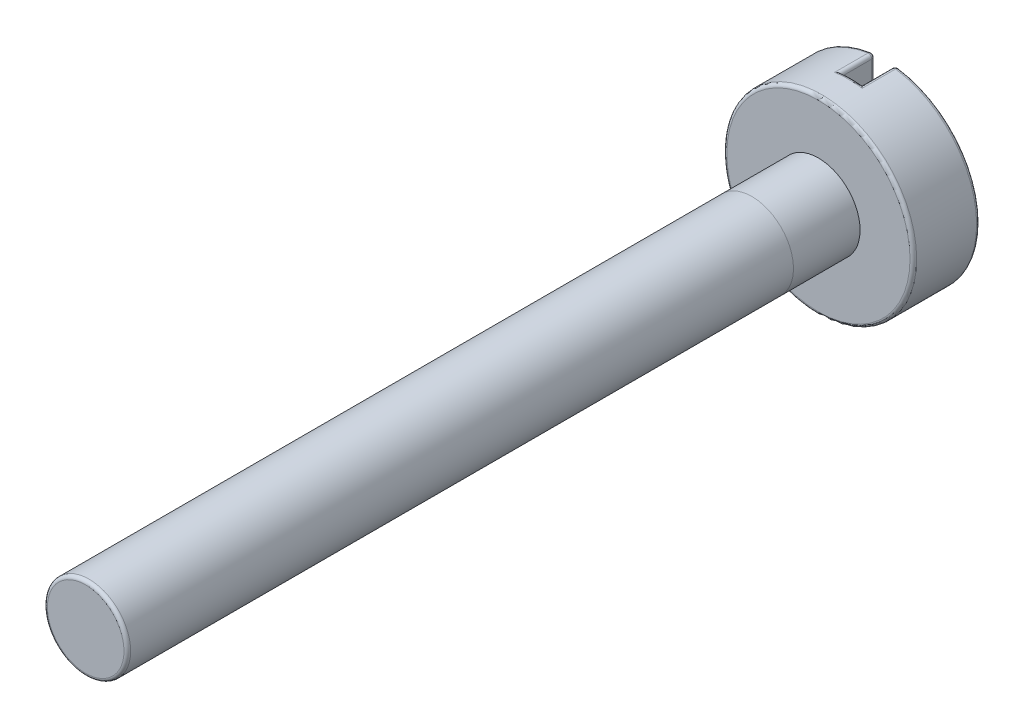
ISO-10303-21;
HEADER;
FILE_DESCRIPTION(('STEP AP214'),'2;1');
FILE_NAME('part.step','',(''),(''),'','','');
FILE_SCHEMA(('AUTOMOTIVE_DESIGN { 1 0 10303 214 1 1 1 1 }'));
ENDSEC;
DATA;
#1=APPLICATION_CONTEXT('core data for automotive mechanical design processes');
#2=APPLICATION_PROTOCOL_DEFINITION('international standard','automotive_design',2000,#1);
#3=PRODUCT_CONTEXT('',#1,'mechanical');
#4=PRODUCT('Part','Part','',(#3));
#5=PRODUCT_RELATED_PRODUCT_CATEGORY('part','',(#4));
#6=PRODUCT_DEFINITION_FORMATION('','',#4);
#7=PRODUCT_DEFINITION_CONTEXT('part definition',#1,'design');
#8=PRODUCT_DEFINITION('design','',#6,#7);
#9=PRODUCT_DEFINITION_SHAPE('','',#8);
#10=(LENGTH_UNIT() NAMED_UNIT(*) SI_UNIT(.MILLI.,.METRE.));
#11=(NAMED_UNIT(*) PLANE_ANGLE_UNIT() SI_UNIT($,.RADIAN.));
#12=(NAMED_UNIT(*) SI_UNIT($,.STERADIAN.) SOLID_ANGLE_UNIT());
#13=UNCERTAINTY_MEASURE_WITH_UNIT(LENGTH_MEASURE(1.E-05),#10,'distance_accuracy_value','');
#14=(GEOMETRIC_REPRESENTATION_CONTEXT(3) GLOBAL_UNCERTAINTY_ASSIGNED_CONTEXT((#13)) GLOBAL_UNIT_ASSIGNED_CONTEXT((#10,
#11,#12)) REPRESENTATION_CONTEXT('',''));
#15=CARTESIAN_POINT('',(0.,0.,0.));
#16=DIRECTION('',(0.,0.,1.));
#17=DIRECTION('',(1.,0.,0.));
#18=AXIS2_PLACEMENT_3D('',#15,#16,#17);
#19=CARTESIAN_POINT('',(0.,0.,11.));
#20=DIRECTION('',(0.,0.,-1.));
#21=DIRECTION('',(-1.,0.,0.));
#22=AXIS2_PLACEMENT_3D('',#19,#20,#21);
#23=CYLINDRICAL_SURFACE('',#22,0.625);
#24=CARTESIAN_POINT('',(0.,0.,10.95));
#25=DIRECTION('',(0.,0.,1.));
#26=DIRECTION('',(1.,0.,0.));
#27=AXIS2_PLACEMENT_3D('',#24,#25,#26);
#28=CIRCLE('',#27,0.625);
#29=CARTESIAN_POINT('',(0.625,0.,10.95));
#30=VERTEX_POINT('',#29);
#31=EDGE_CURVE('E175',#30,#30,#28,.F.);
#32=ORIENTED_EDGE('',*,*,#31,.T.);
#33=EDGE_LOOP('',(#32));
#34=FACE_BOUND('',#33,.T.);
#35=CARTESIAN_POINT('',(0.,0.,0.999999999999999));
#36=DIRECTION('',(0.,0.,-1.));
#37=DIRECTION('',(-1.,0.,0.));
#38=AXIS2_PLACEMENT_3D('',#35,#36,#37);
#39=CIRCLE('',#38,0.625);
#40=CARTESIAN_POINT('',(-0.625,0.,0.999999999999999));
#41=VERTEX_POINT('',#40);
#42=EDGE_CURVE('E11',#41,#41,#39,.T.);
#43=ORIENTED_EDGE('',*,*,#42,.F.);
#44=EDGE_LOOP('',(#43));
#45=FACE_BOUND('',#44,.T.);
#46=ADVANCED_FACE('F45',(#34,#45),#23,.T.);
#47=CARTESIAN_POINT('',(0.,0.,-1.));
#48=DIRECTION('',(0.,0.,1.));
#49=DIRECTION('',(1.,0.,0.));
#50=AXIS2_PLACEMENT_3D('',#47,#48,#49);
#51=PLANE('',#50);
#52=DIRECTION('',(0.,-1.,0.));
#53=VECTOR('',#52,1.);
#54=CARTESIAN_POINT('',(-0.2,0.,-1.));
#55=LINE('',#54,#53);
#56=CARTESIAN_POINT('',(-0.2,1.36037678604128,-1.));
#57=VERTEX_POINT('',#56);
#58=CARTESIAN_POINT('',(-0.2,-1.36037678604128,-1.));
#59=VERTEX_POINT('',#58);
#60=EDGE_CURVE('E212',#57,#59,#55,.T.);
#61=ORIENTED_EDGE('',*,*,#60,.T.);
#62=CARTESIAN_POINT('',(0.,0.,-1.));
#63=DIRECTION('',(0.,0.,1.));
#64=DIRECTION('',(1.,0.,0.));
#65=AXIS2_PLACEMENT_3D('',#62,#63,#64);
#66=CIRCLE('',#65,1.375);
#67=EDGE_CURVE('E214',#59,#57,#66,.F.);
#68=ORIENTED_EDGE('',*,*,#67,.T.);
#69=EDGE_LOOP('',(#61,#68));
#70=FACE_BOUND('',#69,.T.);
#71=ADVANCED_FACE('F311',(#70),#51,.F.);
#72=ORIENTED_EDGE('',*,*,#42,.T.);
#73=EDGE_LOOP('',(#72));
#74=FACE_BOUND('',#73,.T.);
#75=CARTESIAN_POINT('',(0.,0.,0.));
#76=DIRECTION('',(0.,0.,1.));
#77=DIRECTION('',(1.,0.,0.));
#78=AXIS2_PLACEMENT_3D('',#75,#76,#77);
#79=CIRCLE('',#78,0.625);
#80=CARTESIAN_POINT('',(0.625,0.,0.));
#81=VERTEX_POINT('',#80);
#82=EDGE_CURVE('E337',#81,#81,#79,.T.);
#83=ORIENTED_EDGE('',*,*,#82,.T.);
#84=EDGE_LOOP('',(#83));
#85=FACE_BOUND('',#84,.T.);
#86=ADVANCED_FACE('F314',(#74,#85),#23,.T.);
#87=CARTESIAN_POINT('',(0.,0.,11.));
#88=DIRECTION('',(0.,0.,1.));
#89=DIRECTION('',(1.,0.,0.));
#90=AXIS2_PLACEMENT_3D('',#87,#88,#89);
#91=PLANE('',#90);
#92=CARTESIAN_POINT('',(0.,0.,11.));
#93=DIRECTION('',(0.,0.,1.));
#94=DIRECTION('',(1.,0.,0.));
#95=AXIS2_PLACEMENT_3D('',#92,#93,#94);
#96=CIRCLE('',#95,0.575);
#97=CARTESIAN_POINT('',(0.575,0.,11.));
#98=VERTEX_POINT('',#97);
#99=EDGE_CURVE('E339',#98,#98,#96,.T.);
#100=ORIENTED_EDGE('',*,*,#99,.T.);
#101=EDGE_LOOP('',(#100));
#102=FACE_BOUND('',#101,.T.);
#103=ADVANCED_FACE('F326',(#102),#91,.T.);
#104=CARTESIAN_POINT('',(0.,0.,-1.));
#105=DIRECTION('',(0.,0.,1.));
#106=DIRECTION('',(1.,0.,0.));
#107=AXIS2_PLACEMENT_3D('',#104,#105,#106);
#108=CYLINDRICAL_SURFACE('',#107,1.425);
#109=CARTESIAN_POINT('',(0.,0.,-0.05));
#110=DIRECTION('',(0.,0.,1.));
#111=DIRECTION('',(1.,0.,0.));
#112=AXIS2_PLACEMENT_3D('',#109,#110,#111);
#113=CIRCLE('',#112,1.425);
#114=CARTESIAN_POINT('',(1.425,0.,-0.05));
#115=VERTEX_POINT('',#114);
#116=EDGE_CURVE('E189',#115,#115,#113,.F.);
#117=ORIENTED_EDGE('',*,*,#116,.T.);
#118=EDGE_LOOP('',(#117));
#119=FACE_BOUND('',#118,.T.);
#120=DIRECTION('',(0.,0.,1.));
#121=VECTOR('',#120,1.);
#122=CARTESIAN_POINT('',(0.207272727272727,-1.40984503280642,-1.));
#123=LINE('',#122,#121);
#124=CARTESIAN_POINT('',(0.207272727272727,-1.40984503280642,-0.45));
#125=VERTEX_POINT('',#124);
#126=CARTESIAN_POINT('',(0.207272727272727,-1.40984503280642,-0.95));
#127=VERTEX_POINT('',#126);
#128=EDGE_CURVE('E185',#125,#127,#123,.F.);
#129=ORIENTED_EDGE('',*,*,#128,.T.);
#130=CARTESIAN_POINT('',(0.,0.,-0.95));
#131=DIRECTION('',(0.,0.,1.));
#132=DIRECTION('',(1.,0.,0.));
#133=AXIS2_PLACEMENT_3D('',#130,#131,#132);
#134=CIRCLE('',#133,1.425);
#135=CARTESIAN_POINT('',(0.207272727272727,1.40984503280642,-0.95));
#136=VERTEX_POINT('',#135);
#137=EDGE_CURVE('E187',#127,#136,#134,.T.);
#138=ORIENTED_EDGE('',*,*,#137,.T.);
#139=DIRECTION('',(0.,0.,1.));
#140=VECTOR('',#139,1.);
#141=CARTESIAN_POINT('',(0.207272727272727,1.40984503280642,-1.));
#142=LINE('',#141,#140);
#143=CARTESIAN_POINT('',(0.207272727272727,1.40984503280642,-0.45));
#144=VERTEX_POINT('',#143);
#145=EDGE_CURVE('E183',#136,#144,#142,.T.);
#146=ORIENTED_EDGE('',*,*,#145,.T.);
#147=CARTESIAN_POINT('',(0.,0.,-0.45));
#148=DIRECTION('',(0.,0.,-1.));
#149=DIRECTION('',(-1.,0.,0.));
#150=AXIS2_PLACEMENT_3D('',#147,#148,#149);
#151=CIRCLE('',#150,1.425);
#152=CARTESIAN_POINT('',(-0.207272727272727,1.40984503280642,-0.45));
#153=VERTEX_POINT('',#152);
#154=EDGE_CURVE('E141',#144,#153,#151,.F.);
#155=ORIENTED_EDGE('',*,*,#154,.T.);
#156=DIRECTION('',(0.,0.,1.));
#157=VECTOR('',#156,1.);
#158=CARTESIAN_POINT('',(-0.207272727272727,1.40984503280642,-1.));
#159=LINE('',#158,#157);
#160=CARTESIAN_POINT('',(-0.207272727272727,1.40984503280642,-0.95));
#161=VERTEX_POINT('',#160);
#162=EDGE_CURVE('E133',#153,#161,#159,.F.);
#163=ORIENTED_EDGE('',*,*,#162,.T.);
#164=CARTESIAN_POINT('',(0.,0.,-0.95));
#165=DIRECTION('',(0.,0.,1.));
#166=DIRECTION('',(1.,0.,0.));
#167=AXIS2_PLACEMENT_3D('',#164,#165,#166);
#168=CIRCLE('',#167,1.425);
#169=CARTESIAN_POINT('',(-0.207272727272728,-1.40984503280642,-0.95));
#170=VERTEX_POINT('',#169);
#171=EDGE_CURVE('E138',#161,#170,#168,.T.);
#172=ORIENTED_EDGE('',*,*,#171,.T.);
#173=DIRECTION('',(0.,0.,1.));
#174=VECTOR('',#173,1.);
#175=CARTESIAN_POINT('',(-0.207272727272728,-1.40984503280642,-1.));
#176=LINE('',#175,#174);
#177=CARTESIAN_POINT('',(-0.207272727272728,-1.40984503280642,-0.45));
#178=VERTEX_POINT('',#177);
#179=EDGE_CURVE('E144',#170,#178,#176,.T.);
#180=ORIENTED_EDGE('',*,*,#179,.T.);
#181=CARTESIAN_POINT('',(0.,0.,-0.45));
#182=DIRECTION('',(0.,0.,-1.));
#183=DIRECTION('',(-1.,0.,0.));
#184=AXIS2_PLACEMENT_3D('',#181,#182,#183);
#185=CIRCLE('',#184,1.425);
#186=EDGE_CURVE('E181',#178,#125,#185,.F.);
#187=ORIENTED_EDGE('',*,*,#186,.T.);
#188=EDGE_LOOP('',(#129,#138,#146,#155,#163,#172,#180,#187));
#189=FACE_BOUND('',#188,.T.);
#190=ADVANCED_FACE('F135',(#119,#189),#108,.T.);
#191=CARTESIAN_POINT('',(0.,0.,-1.));
#192=DIRECTION('',(0.,0.,1.));
#193=DIRECTION('',(1.,0.,0.));
#194=AXIS2_PLACEMENT_3D('',#191,#192,#193);
#195=CIRCLE('',#194,1.375);
#196=CARTESIAN_POINT('',(0.2,1.36037678604128,-1.));
#197=VERTEX_POINT('',#196);
#198=CARTESIAN_POINT('',(0.2,-1.36037678604128,-1.));
#199=VERTEX_POINT('',#198);
#200=EDGE_CURVE('E207',#197,#199,#195,.F.);
#201=ORIENTED_EDGE('',*,*,#200,.T.);
#202=DIRECTION('',(0.,1.,0.));
#203=VECTOR('',#202,1.);
#204=CARTESIAN_POINT('',(0.2,0.,-1.));
#205=LINE('',#204,#203);
#206=EDGE_CURVE('E209',#199,#197,#205,.T.);
#207=ORIENTED_EDGE('',*,*,#206,.T.);
#208=EDGE_LOOP('',(#201,#207));
#209=FACE_BOUND('',#208,.T.);
#210=ADVANCED_FACE('F320',(#209),#51,.F.);
#211=CARTESIAN_POINT('',(0.,0.,0.));
#212=DIRECTION('',(0.,0.,1.));
#213=DIRECTION('',(1.,0.,0.));
#214=AXIS2_PLACEMENT_3D('',#211,#212,#213);
#215=PLANE('',#214);
#216=CARTESIAN_POINT('',(0.,0.,0.));
#217=DIRECTION('',(0.,0.,1.));
#218=DIRECTION('',(1.,0.,0.));
#219=AXIS2_PLACEMENT_3D('',#216,#217,#218);
#220=CIRCLE('',#219,1.375);
#221=CARTESIAN_POINT('',(1.375,0.,0.));
#222=VERTEX_POINT('',#221);
#223=EDGE_CURVE('E172',#222,#222,#220,.T.);
#224=ORIENTED_EDGE('',*,*,#223,.T.);
#225=EDGE_LOOP('',(#224));
#226=FACE_BOUND('',#225,.T.);
#227=ORIENTED_EDGE('',*,*,#82,.F.);
#228=EDGE_LOOP('',(#227));
#229=FACE_BOUND('',#228,.T.);
#230=ADVANCED_FACE('F370',(#226,#229),#215,.T.);
#231=CARTESIAN_POINT('',(-0.15,4.18375597630475,-0.5));
#232=DIRECTION('',(-1.,0.,0.));
#233=DIRECTION('',(0.,-1.,0.));
#234=AXIS2_PLACEMENT_3D('',#231,#232,#233);
#235=PLANE('',#234);
#236=DIRECTION('',(0.,1.,0.));
#237=VECTOR('',#236,1.);
#238=CARTESIAN_POINT('',(-0.15,4.18375597630475,-0.5));
#239=LINE('',#238,#237);
#240=CARTESIAN_POINT('',(-0.15,-1.36037678604128,-0.5));
#241=VERTEX_POINT('',#240);
#242=CARTESIAN_POINT('',(-0.15,1.36037678604128,-0.5));
#243=VERTEX_POINT('',#242);
#244=EDGE_CURVE('E345',#241,#243,#239,.T.);
#245=ORIENTED_EDGE('',*,*,#244,.F.);
#246=DIRECTION('',(0.,0.,-1.));
#247=VECTOR('',#246,1.);
#248=CARTESIAN_POINT('',(-0.15,-1.36037678604128,-1.));
#249=LINE('',#248,#247);
#250=CARTESIAN_POINT('',(-0.15,-1.36037678604128,-0.95));
#251=VERTEX_POINT('',#250);
#252=EDGE_CURVE('E195',#241,#251,#249,.T.);
#253=ORIENTED_EDGE('',*,*,#252,.T.);
#254=DIRECTION('',(0.,-1.,0.));
#255=VECTOR('',#254,1.);
#256=CARTESIAN_POINT('',(-0.15,4.18375597630475,-0.95));
#257=LINE('',#256,#255);
#258=CARTESIAN_POINT('',(-0.15,1.36037678604128,-0.95));
#259=VERTEX_POINT('',#258);
#260=EDGE_CURVE('E192',#251,#259,#257,.F.);
#261=ORIENTED_EDGE('',*,*,#260,.T.);
#262=DIRECTION('',(0.,0.,-1.));
#263=VECTOR('',#262,1.);
#264=CARTESIAN_POINT('',(-0.15,1.36037678604128,-0.5));
#265=LINE('',#264,#263);
#266=EDGE_CURVE('E152',#259,#243,#265,.F.);
#267=ORIENTED_EDGE('',*,*,#266,.T.);
#268=EDGE_LOOP('',(#245,#253,#261,#267));
#269=FACE_BOUND('',#268,.T.);
#270=ADVANCED_FACE('F365',(#269),#235,.F.);
#271=CARTESIAN_POINT('',(0.15,4.18375597630475,-0.5));
#272=DIRECTION('',(1.,0.,0.));
#273=DIRECTION('',(0.,1.,0.));
#274=AXIS2_PLACEMENT_3D('',#271,#272,#273);
#275=PLANE('',#274);
#276=DIRECTION('',(0.,1.,0.));
#277=VECTOR('',#276,1.);
#278=CARTESIAN_POINT('',(0.15,4.18375597630475,-0.95));
#279=LINE('',#278,#277);
#280=CARTESIAN_POINT('',(0.15,1.36037678604128,-0.95));
#281=VERTEX_POINT('',#280);
#282=CARTESIAN_POINT('',(0.15,-1.36037678604128,-0.95));
#283=VERTEX_POINT('',#282);
#284=EDGE_CURVE('E201',#281,#283,#279,.F.);
#285=ORIENTED_EDGE('',*,*,#284,.T.);
#286=DIRECTION('',(0.,0.,-1.));
#287=VECTOR('',#286,1.);
#288=CARTESIAN_POINT('',(0.15,-1.36037678604128,-0.5));
#289=LINE('',#288,#287);
#290=CARTESIAN_POINT('',(0.15,-1.36037678604128,-0.5));
#291=VERTEX_POINT('',#290);
#292=EDGE_CURVE('E205',#283,#291,#289,.F.);
#293=ORIENTED_EDGE('',*,*,#292,.T.);
#294=DIRECTION('',(0.,-1.,0.));
#295=VECTOR('',#294,1.);
#296=CARTESIAN_POINT('',(0.15,4.18375597630475,-0.5));
#297=LINE('',#296,#295);
#298=CARTESIAN_POINT('',(0.15,1.36037678604128,-0.5));
#299=VERTEX_POINT('',#298);
#300=EDGE_CURVE('E340',#299,#291,#297,.T.);
#301=ORIENTED_EDGE('',*,*,#300,.F.);
#302=DIRECTION('',(0.,0.,-1.));
#303=VECTOR('',#302,1.);
#304=CARTESIAN_POINT('',(0.15,1.36037678604128,-1.));
#305=LINE('',#304,#303);
#306=EDGE_CURVE('E203',#299,#281,#305,.T.);
#307=ORIENTED_EDGE('',*,*,#306,.T.);
#308=EDGE_LOOP('',(#285,#293,#301,#307));
#309=FACE_BOUND('',#308,.T.);
#310=ADVANCED_FACE('F360',(#309),#275,.F.);
#311=CARTESIAN_POINT('',(0.,0.,-0.5));
#312=DIRECTION('',(0.,0.,-1.));
#313=DIRECTION('',(-1.,0.,0.));
#314=AXIS2_PLACEMENT_3D('',#311,#312,#313);
#315=PLANE('',#314);
#316=ORIENTED_EDGE('',*,*,#300,.T.);
#317=CARTESIAN_POINT('',(0.2,-1.36037678604128,-0.5));
#318=DIRECTION('',(0.,0.,-1.));
#319=DIRECTION('',(-1.,0.,0.));
#320=AXIS2_PLACEMENT_3D('',#317,#318,#319);
#321=CIRCLE('',#320,0.05);
#322=CARTESIAN_POINT('',(0.150407699075441,-1.36674888844251,-0.5));
#323=VERTEX_POINT('',#322);
#324=EDGE_CURVE('E218',#291,#323,#321,.F.);
#325=ORIENTED_EDGE('',*,*,#324,.T.);
#326=CARTESIAN_POINT('',(0.,0.,-0.5));
#327=DIRECTION('',(0.,0.,-1.));
#328=DIRECTION('',(-1.,0.,0.));
#329=AXIS2_PLACEMENT_3D('',#326,#327,#328);
#330=CIRCLE('',#329,1.375);
#331=CARTESIAN_POINT('',(-0.150407699075441,-1.36674888844251,-0.5));
#332=VERTEX_POINT('',#331);
#333=EDGE_CURVE('E199',#323,#332,#330,.T.);
#334=ORIENTED_EDGE('',*,*,#333,.T.);
#335=CARTESIAN_POINT('',(-0.2,-1.36037678604128,-0.5));
#336=DIRECTION('',(0.,0.,-1.));
#337=DIRECTION('',(-1.,0.,0.));
#338=AXIS2_PLACEMENT_3D('',#335,#336,#337);
#339=CIRCLE('',#338,0.05);
#340=EDGE_CURVE('E216',#332,#241,#339,.F.);
#341=ORIENTED_EDGE('',*,*,#340,.T.);
#342=ORIENTED_EDGE('',*,*,#244,.T.);
#343=CARTESIAN_POINT('',(-0.2,1.36037678604128,-0.5));
#344=DIRECTION('',(0.,0.,-1.));
#345=DIRECTION('',(-1.,0.,0.));
#346=AXIS2_PLACEMENT_3D('',#343,#344,#345);
#347=CIRCLE('',#346,0.05);
#348=CARTESIAN_POINT('',(-0.150407699075441,1.36674888844251,-0.5));
#349=VERTEX_POINT('',#348);
#350=EDGE_CURVE('E221',#243,#349,#347,.F.);
#351=ORIENTED_EDGE('',*,*,#350,.T.);
#352=CARTESIAN_POINT('',(0.,0.,-0.5));
#353=DIRECTION('',(0.,0.,-1.));
#354=DIRECTION('',(-1.,0.,0.));
#355=AXIS2_PLACEMENT_3D('',#352,#353,#354);
#356=CIRCLE('',#355,1.375);
#357=CARTESIAN_POINT('',(0.150407699075441,1.36674888844251,-0.5));
#358=VERTEX_POINT('',#357);
#359=EDGE_CURVE('E61',#349,#358,#356,.T.);
#360=ORIENTED_EDGE('',*,*,#359,.T.);
#361=CARTESIAN_POINT('',(0.2,1.36037678604128,-0.5));
#362=DIRECTION('',(0.,0.,-1.));
#363=DIRECTION('',(-1.,0.,0.));
#364=AXIS2_PLACEMENT_3D('',#361,#362,#363);
#365=CIRCLE('',#364,0.05);
#366=EDGE_CURVE('E54',#358,#299,#365,.F.);
#367=ORIENTED_EDGE('',*,*,#366,.T.);
#368=EDGE_LOOP('',(#316,#325,#334,#341,#342,#351,#360,#367));
#369=FACE_BOUND('',#368,.T.);
#370=ADVANCED_FACE('F353',(#369),#315,.T.);
#371=CARTESIAN_POINT('',(0.,0.,10.95));
#372=DIRECTION('',(0.,0.,1.));
#373=DIRECTION('',(1.,0.,0.));
#374=AXIS2_PLACEMENT_3D('',#371,#372,#373);
#375=TOROIDAL_SURFACE('',#374,0.575,0.05);
#376=ORIENTED_EDGE('',*,*,#31,.F.);
#377=EDGE_LOOP('',(#376));
#378=FACE_BOUND('',#377,.T.);
#379=ORIENTED_EDGE('',*,*,#99,.F.);
#380=EDGE_LOOP('',(#379));
#381=FACE_BOUND('',#380,.T.);
#382=ADVANCED_FACE('F350',(#378,#381),#375,.T.);
#383=CARTESIAN_POINT('',(0.,0.,-0.05));
#384=DIRECTION('',(0.,0.,1.));
#385=DIRECTION('',(1.,0.,0.));
#386=AXIS2_PLACEMENT_3D('',#383,#384,#385);
#387=TOROIDAL_SURFACE('',#386,1.375,0.05);
#388=ORIENTED_EDGE('',*,*,#116,.F.);
#389=EDGE_LOOP('',(#388));
#390=FACE_BOUND('',#389,.T.);
#391=ORIENTED_EDGE('',*,*,#223,.F.);
#392=EDGE_LOOP('',(#391));
#393=FACE_BOUND('',#392,.T.);
#394=ADVANCED_FACE('F301',(#390,#393),#387,.T.);
#395=CARTESIAN_POINT('',(0.2,1.36037678604128,-1.));
#396=DIRECTION('',(0.,0.,1.));
#397=DIRECTION('',(1.,0.,0.));
#398=AXIS2_PLACEMENT_3D('',#395,#396,#397);
#399=CYLINDRICAL_SURFACE('',#398,0.05);
#400=CARTESIAN_POINT('',(0.2,1.36037678604128,-0.95));
#401=DIRECTION('',(0.,0.,-1.));
#402=DIRECTION('',(-1.,0.,0.));
#403=AXIS2_PLACEMENT_3D('',#400,#401,#402);
#404=CIRCLE('',#403,0.05);
#405=EDGE_CURVE('E296',#281,#136,#404,.T.);
#406=ORIENTED_EDGE('',*,*,#405,.F.);
#407=ORIENTED_EDGE('',*,*,#306,.F.);
#408=ORIENTED_EDGE('',*,*,#366,.F.);
#409=CARTESIAN_POINT('',(0.150407699075441,1.36674888844251,-0.5));
#410=CARTESIAN_POINT('',(0.150691221530179,1.36898500800024,-0.500003667406844));
#411=CARTESIAN_POINT('',(0.151132358820443,1.37119484311205,-0.49984788398371));
#412=CARTESIAN_POINT('',(0.152286249924826,1.37548240690314,-0.499252235740836));
#413=CARTESIAN_POINT('',(0.15299660193768,1.37756111943839,-0.498814859711815));
#414=CARTESIAN_POINT('',(0.15464922140125,1.38154223588925,-0.497691396761168));
#415=CARTESIAN_POINT('',(0.155590813331579,1.38344513152396,-0.497006031577078));
#416=CARTESIAN_POINT('',(0.157661692086564,1.38705652809242,-0.495428916508389));
#417=CARTESIAN_POINT('',(0.158791406429586,1.38876457096442,-0.494536694676617));
#418=CARTESIAN_POINT('',(0.161684900099365,1.39262437990935,-0.49218998157354));
#419=CARTESIAN_POINT('',(0.163519573436742,1.3946736917554,-0.490654462049119));
#420=CARTESIAN_POINT('',(0.167379190651771,1.39836417522202,-0.487351273496218));
#421=CARTESIAN_POINT('',(0.169404482760758,1.40000457908123,-0.485583177148292));
#422=CARTESIAN_POINT('',(0.174349892331031,1.4034370573129,-0.481198602332158));
#423=CARTESIAN_POINT('',(0.177323518733182,1.40506012677509,-0.478510514078987));
#424=CARTESIAN_POINT('',(0.183379291452824,1.40764849361326,-0.472950153617756));
#425=CARTESIAN_POINT('',(0.18646155365022,1.40861306478802,-0.470077681874478));
#426=CARTESIAN_POINT('',(0.192349641278998,1.4098704016842,-0.464516501132324));
#427=CARTESIAN_POINT('',(0.195152924940253,1.41021978552338,-0.46183740592699));
#428=CARTESIAN_POINT('',(0.200733523548038,1.41044914444586,-0.456441760230855));
#429=CARTESIAN_POINT('',(0.203510878567297,1.41033003645294,-0.453725293262571));
#430=CARTESIAN_POINT('',(0.206594798163377,1.4099411431641,-0.450672579457399));
#431=CARTESIAN_POINT('',(0.206934038849952,1.40989482091585,-0.45033626897457));
#432=CARTESIAN_POINT('',(0.207272727272727,1.40984503280642,-0.45));
#433=B_SPLINE_CURVE_WITH_KNOTS('',3,(#409,#410,#411,#412,#413,#414,#415,#416,#417,#418,#419,
#420,#421,#422,#423,#424,#425,#426,#427,#428,#429,#430,#431,#432),.UNSPECIFIED.,.F.,.F.,(4,2,2,
2,2,2,2,2,2,2,2,4),(0.,0.00674186998593655,0.0134249566150757,0.0200887474770359,
0.0267678941732615,0.0361662575867914,0.0455821365581843,0.0584867773555543,0.0714056266827052,
0.0830572263177361,0.0946860330097861,0.096125768600275),.UNSPECIFIED.);
#434=EDGE_CURVE('E291',#144,#358,#433,.F.);
#435=ORIENTED_EDGE('',*,*,#434,.F.);
#436=ORIENTED_EDGE('',*,*,#145,.F.);
#437=EDGE_LOOP('',(#406,#407,#408,#435,#436));
#438=FACE_BOUND('',#437,.T.);
#439=ADVANCED_FACE('F298',(#438),#399,.T.);
#440=CARTESIAN_POINT('',(0.2,1.36037678604128,-0.95));
#441=DIRECTION('',(0.,0.,-1.));
#442=DIRECTION('',(-1.,0.,0.));
#443=AXIS2_PLACEMENT_3D('',#440,#441,#442);
#444=SPHERICAL_SURFACE('',#443,0.05);
#445=CARTESIAN_POINT('',(0.2,1.36037678604128,-0.95));
#446=DIRECTION('',(0.,1.,0.));
#447=DIRECTION('',(-1.,0.,0.));
#448=AXIS2_PLACEMENT_3D('',#445,#446,#447);
#449=CIRCLE('',#448,0.05);
#450=EDGE_CURVE('E278',#281,#197,#449,.F.);
#451=ORIENTED_EDGE('',*,*,#450,.F.);
#452=ORIENTED_EDGE('',*,*,#405,.T.);
#453=CARTESIAN_POINT('',(0.2,1.36037678604128,-0.95));
#454=DIRECTION('',(-0.989364935302748,0.145454545454545,0.));
#455=DIRECTION('',(-0.145454545454545,-0.989364935302748,0.));
#456=AXIS2_PLACEMENT_3D('',#453,#454,#455);
#457=CIRCLE('',#456,0.05);
#458=EDGE_CURVE('E297',#197,#136,#457,.F.);
#459=ORIENTED_EDGE('',*,*,#458,.F.);
#460=EDGE_LOOP('',(#451,#452,#459));
#461=FACE_BOUND('',#460,.T.);
#462=ADVANCED_FACE('F47',(#461),#444,.T.);
#463=CARTESIAN_POINT('',(0.,0.,-0.45));
#464=DIRECTION('',(0.,0.,-1.));
#465=DIRECTION('',(-1.,0.,0.));
#466=AXIS2_PLACEMENT_3D('',#463,#464,#465);
#467=TOROIDAL_SURFACE('',#466,1.375,0.05);
#468=ORIENTED_EDGE('',*,*,#359,.F.);
#469=CARTESIAN_POINT('',(-0.150407699075441,1.36674888844251,-0.5));
#470=CARTESIAN_POINT('',(-0.150691221530179,1.36898500800024,-0.500003667406844));
#471=CARTESIAN_POINT('',(-0.151132358820442,1.37119484311205,-0.49984788398371));
#472=CARTESIAN_POINT('',(-0.152286249924826,1.37548240690314,-0.499252235740836));
#473=CARTESIAN_POINT('',(-0.15299660193768,1.37756111943839,-0.498814859711815));
#474=CARTESIAN_POINT('',(-0.15464922140125,1.38154223588925,-0.497691396761168));
#475=CARTESIAN_POINT('',(-0.155590813331579,1.38344513152396,-0.497006031577078));
#476=CARTESIAN_POINT('',(-0.157661692086564,1.38705652809242,-0.495428916508389));
#477=CARTESIAN_POINT('',(-0.158791406429586,1.38876457096442,-0.494536694676617));
#478=CARTESIAN_POINT('',(-0.161684900099364,1.39262437990935,-0.49218998157354));
#479=CARTESIAN_POINT('',(-0.163519573436742,1.3946736917554,-0.490654462049119));
#480=CARTESIAN_POINT('',(-0.167379190651771,1.39836417522202,-0.487351273496218));
#481=CARTESIAN_POINT('',(-0.169404482760758,1.40000457908123,-0.485583177148292));
#482=CARTESIAN_POINT('',(-0.17434989233103,1.4034370573129,-0.481198602332158));
#483=CARTESIAN_POINT('',(-0.177323518733183,1.40506012677509,-0.478510514078987));
#484=CARTESIAN_POINT('',(-0.183379291452824,1.40764849361326,-0.472950153617756));
#485=CARTESIAN_POINT('',(-0.186461553650219,1.40861306478802,-0.470077681874478));
#486=CARTESIAN_POINT('',(-0.192349641278999,1.4098704016842,-0.464516501132325));
#487=CARTESIAN_POINT('',(-0.195152924940256,1.41021978552338,-0.461837405926992));
#488=CARTESIAN_POINT('',(-0.200733523548034,1.41044914444586,-0.456441760230851));
#489=CARTESIAN_POINT('',(-0.203510878567286,1.41033003645294,-0.453725293262561));
#490=CARTESIAN_POINT('',(-0.206594798163374,1.4099411431641,-0.450672579457396));
#491=CARTESIAN_POINT('',(-0.206934038849951,1.40989482091585,-0.450336268974568));
#492=CARTESIAN_POINT('',(-0.207272727272727,1.40984503280642,-0.45));
#493=B_SPLINE_CURVE_WITH_KNOTS('',3,(#469,#470,#471,#472,#473,#474,#475,#476,#477,#478,#479,
#480,#481,#482,#483,#484,#485,#486,#487,#488,#489,#490,#491,#492),.UNSPECIFIED.,.F.,.F.,(4,2,2,
2,2,2,2,2,2,2,2,4),(0.,0.00674186998593655,0.0134249566150757,0.0200887474770358,
0.0267678941732616,0.0361662575867915,0.0455821365581844,0.0584867773555542,0.071405626682705,
0.0830572263177361,0.0946860330097861,0.096125768600275),.UNSPECIFIED.);
#494=EDGE_CURVE('E270',#153,#349,#493,.F.);
#495=ORIENTED_EDGE('',*,*,#494,.F.);
#496=ORIENTED_EDGE('',*,*,#154,.F.);
#497=ORIENTED_EDGE('',*,*,#434,.T.);
#498=EDGE_LOOP('',(#468,#495,#496,#497));
#499=FACE_BOUND('',#498,.T.);
#500=ADVANCED_FACE('F282',(#499),#467,.T.);
#501=CARTESIAN_POINT('',(0.,0.,-0.95));
#502=DIRECTION('',(0.,0.,1.));
#503=DIRECTION('',(1.,0.,0.));
#504=AXIS2_PLACEMENT_3D('',#501,#502,#503);
#505=TOROIDAL_SURFACE('',#504,1.375,0.05);
#506=ORIENTED_EDGE('',*,*,#458,.T.);
#507=ORIENTED_EDGE('',*,*,#137,.F.);
#508=CARTESIAN_POINT('',(0.2,-1.36037678604128,-0.95));
#509=DIRECTION('',(-0.989364935302748,-0.145454545454546,0.));
#510=DIRECTION('',(0.145454545454546,-0.989364935302748,0.));
#511=AXIS2_PLACEMENT_3D('',#508,#509,#510);
#512=CIRCLE('',#511,0.05);
#513=EDGE_CURVE('E267',#199,#127,#512,.T.);
#514=ORIENTED_EDGE('',*,*,#513,.F.);
#515=ORIENTED_EDGE('',*,*,#200,.F.);
#516=EDGE_LOOP('',(#506,#507,#514,#515));
#517=FACE_BOUND('',#516,.T.);
#518=ADVANCED_FACE('F286',(#517),#505,.T.);
#519=CARTESIAN_POINT('',(0.2,0.,-0.95));
#520=DIRECTION('',(0.,1.,0.));
#521=DIRECTION('',(-1.,0.,0.));
#522=AXIS2_PLACEMENT_3D('',#519,#520,#521);
#523=CYLINDRICAL_SURFACE('',#522,0.05);
#524=ORIENTED_EDGE('',*,*,#450,.T.);
#525=ORIENTED_EDGE('',*,*,#206,.F.);
#526=CARTESIAN_POINT('',(0.2,-1.36037678604128,-0.95));
#527=DIRECTION('',(0.,-1.,0.));
#528=DIRECTION('',(0.,0.,-1.));
#529=AXIS2_PLACEMENT_3D('',#526,#527,#528);
#530=CIRCLE('',#529,0.05);
#531=EDGE_CURVE('E156',#283,#199,#530,.T.);
#532=ORIENTED_EDGE('',*,*,#531,.F.);
#533=ORIENTED_EDGE('',*,*,#284,.F.);
#534=EDGE_LOOP('',(#524,#525,#532,#533));
#535=FACE_BOUND('',#534,.T.);
#536=ADVANCED_FACE('F287',(#535),#523,.T.);
#537=CARTESIAN_POINT('',(-0.2,1.36037678604128,-1.));
#538=DIRECTION('',(0.,0.,1.));
#539=DIRECTION('',(1.,0.,0.));
#540=AXIS2_PLACEMENT_3D('',#537,#538,#539);
#541=CYLINDRICAL_SURFACE('',#540,0.05);
#542=ORIENTED_EDGE('',*,*,#350,.F.);
#543=ORIENTED_EDGE('',*,*,#266,.F.);
#544=CARTESIAN_POINT('',(-0.2,1.36037678604128,-0.95));
#545=DIRECTION('',(0.,0.,-1.));
#546=DIRECTION('',(-1.,0.,0.));
#547=AXIS2_PLACEMENT_3D('',#544,#545,#546);
#548=CIRCLE('',#547,0.05);
#549=EDGE_CURVE('E148',#161,#259,#548,.T.);
#550=ORIENTED_EDGE('',*,*,#549,.F.);
#551=ORIENTED_EDGE('',*,*,#162,.F.);
#552=ORIENTED_EDGE('',*,*,#494,.T.);
#553=EDGE_LOOP('',(#542,#543,#550,#551,#552));
#554=FACE_BOUND('',#553,.T.);
#555=ADVANCED_FACE('F151',(#554),#541,.T.);
#556=CARTESIAN_POINT('',(0.2,-1.36037678604128,-0.95));
#557=DIRECTION('',(0.,0.,-1.));
#558=DIRECTION('',(-1.,0.,0.));
#559=AXIS2_PLACEMENT_3D('',#556,#557,#558);
#560=SPHERICAL_SURFACE('',#559,0.05);
#561=ORIENTED_EDGE('',*,*,#531,.T.);
#562=ORIENTED_EDGE('',*,*,#513,.T.);
#563=CARTESIAN_POINT('',(0.2,-1.36037678604128,-0.95));
#564=DIRECTION('',(0.,0.,-1.));
#565=DIRECTION('',(-1.,0.,0.));
#566=AXIS2_PLACEMENT_3D('',#563,#564,#565);
#567=CIRCLE('',#566,0.05);
#568=EDGE_CURVE('E157',#283,#127,#567,.F.);
#569=ORIENTED_EDGE('',*,*,#568,.F.);
#570=EDGE_LOOP('',(#561,#562,#569));
#571=FACE_BOUND('',#570,.T.);
#572=ADVANCED_FACE('F439',(#571),#560,.T.);
#573=CARTESIAN_POINT('',(-0.2,1.36037678604128,-0.95));
#574=DIRECTION('',(0.,0.,-1.));
#575=DIRECTION('',(-1.,0.,0.));
#576=AXIS2_PLACEMENT_3D('',#573,#574,#575);
#577=SPHERICAL_SURFACE('',#576,0.05);
#578=CARTESIAN_POINT('',(-0.2,1.36037678604128,-0.95));
#579=DIRECTION('',(0.989364935302749,0.145454545454544,0.));
#580=DIRECTION('',(-0.145454545454544,0.989364935302749,0.));
#581=AXIS2_PLACEMENT_3D('',#578,#579,#580);
#582=CIRCLE('',#581,0.05);
#583=EDGE_CURVE('E160',#161,#57,#582,.F.);
#584=ORIENTED_EDGE('',*,*,#583,.F.);
#585=ORIENTED_EDGE('',*,*,#549,.T.);
#586=CARTESIAN_POINT('',(-0.2,1.36037678604128,-0.95));
#587=DIRECTION('',(0.,1.,0.));
#588=DIRECTION('',(0.,0.,1.));
#589=AXIS2_PLACEMENT_3D('',#586,#587,#588);
#590=CIRCLE('',#589,0.05);
#591=EDGE_CURVE('E162',#57,#259,#590,.F.);
#592=ORIENTED_EDGE('',*,*,#591,.F.);
#593=EDGE_LOOP('',(#584,#585,#592));
#594=FACE_BOUND('',#593,.T.);
#595=ADVANCED_FACE('F161',(#594),#577,.T.);
#596=CARTESIAN_POINT('',(0.2,-1.36037678604128,-1.));
#597=DIRECTION('',(0.,0.,1.));
#598=DIRECTION('',(1.,0.,0.));
#599=AXIS2_PLACEMENT_3D('',#596,#597,#598);
#600=CYLINDRICAL_SURFACE('',#599,0.05);
#601=ORIENTED_EDGE('',*,*,#568,.T.);
#602=ORIENTED_EDGE('',*,*,#128,.F.);
#603=CARTESIAN_POINT('',(0.150407699075441,-1.36674888844251,-0.5));
#604=CARTESIAN_POINT('',(0.150691221530179,-1.36898500800024,-0.500003667406844));
#605=CARTESIAN_POINT('',(0.151132358820442,-1.37119484311205,-0.49984788398371));
#606=CARTESIAN_POINT('',(0.152286249924826,-1.37548240690314,-0.499252235740836));
#607=CARTESIAN_POINT('',(0.15299660193768,-1.37756111943839,-0.498814859711815));
#608=CARTESIAN_POINT('',(0.15464922140125,-1.38154223588925,-0.497691396761168));
#609=CARTESIAN_POINT('',(0.155590813331579,-1.38344513152396,-0.497006031577078));
#610=CARTESIAN_POINT('',(0.157661692086564,-1.38705652809242,-0.495428916508389));
#611=CARTESIAN_POINT('',(0.158791406429586,-1.38876457096442,-0.494536694676617));
#612=CARTESIAN_POINT('',(0.161684900099364,-1.39262437990935,-0.49218998157354));
#613=CARTESIAN_POINT('',(0.163519573436742,-1.3946736917554,-0.490654462049119));
#614=CARTESIAN_POINT('',(0.167379190651771,-1.39836417522202,-0.487351273496218));
#615=CARTESIAN_POINT('',(0.169404482760758,-1.40000457908123,-0.485583177148292));
#616=CARTESIAN_POINT('',(0.17434989233103,-1.4034370573129,-0.481198602332158));
#617=CARTESIAN_POINT('',(0.177323518733182,-1.40506012677509,-0.478510514078987));
#618=CARTESIAN_POINT('',(0.183379291452824,-1.40764849361326,-0.472950153617756));
#619=CARTESIAN_POINT('',(0.186461553650219,-1.40861306478802,-0.470077681874478));
#620=CARTESIAN_POINT('',(0.192349641278998,-1.4098704016842,-0.464516501132325));
#621=CARTESIAN_POINT('',(0.195152924940255,-1.41021978552338,-0.461837405926991));
#622=CARTESIAN_POINT('',(0.200733523548036,-1.41044914444586,-0.456441760230854));
#623=CARTESIAN_POINT('',(0.203510878567292,-1.41033003645294,-0.453725293262567));
#624=CARTESIAN_POINT('',(0.206594798163375,-1.4099411431641,-0.450672579457398));
#625=CARTESIAN_POINT('',(0.206934038849951,-1.40989482091585,-0.450336268974569));
#626=CARTESIAN_POINT('',(0.207272727272727,-1.40984503280642,-0.45));
#627=B_SPLINE_CURVE_WITH_KNOTS('',3,(#603,#604,#605,#606,#607,#608,#609,#610,#611,#612,#613,
#614,#615,#616,#617,#618,#619,#620,#621,#622,#623,#624,#625,#626),.UNSPECIFIED.,.F.,.F.,(4,2,2,
2,2,2,2,2,2,2,2,4),(0.,0.00674186998593655,0.0134249566150757,0.0200887474770358,
0.0267678941732616,0.0361662575867915,0.0455821365581844,0.0584867773555541,0.0714056266827051,
0.0830572263177361,0.0946860330097861,0.096125768600275),.UNSPECIFIED.);
#628=EDGE_CURVE('E166',#323,#125,#627,.T.);
#629=ORIENTED_EDGE('',*,*,#628,.F.);
#630=ORIENTED_EDGE('',*,*,#324,.F.);
#631=ORIENTED_EDGE('',*,*,#292,.F.);
#632=EDGE_LOOP('',(#601,#602,#629,#630,#631));
#633=FACE_BOUND('',#632,.T.);
#634=ADVANCED_FACE('F247',(#633),#600,.T.);
#635=CARTESIAN_POINT('',(-0.2,0.,-0.95));
#636=DIRECTION('',(0.,-1.,0.));
#637=DIRECTION('',(1.,0.,0.));
#638=AXIS2_PLACEMENT_3D('',#635,#636,#637);
#639=CYLINDRICAL_SURFACE('',#638,0.05);
#640=ORIENTED_EDGE('',*,*,#591,.T.);
#641=ORIENTED_EDGE('',*,*,#260,.F.);
#642=CARTESIAN_POINT('',(-0.2,-1.36037678604128,-0.95));
#643=DIRECTION('',(0.,-1.,0.));
#644=DIRECTION('',(0.,0.,-1.));
#645=AXIS2_PLACEMENT_3D('',#642,#643,#644);
#646=CIRCLE('',#645,0.05);
#647=EDGE_CURVE('E260',#59,#251,#646,.T.);
#648=ORIENTED_EDGE('',*,*,#647,.F.);
#649=ORIENTED_EDGE('',*,*,#60,.F.);
#650=EDGE_LOOP('',(#640,#641,#648,#649));
#651=FACE_BOUND('',#650,.T.);
#652=ADVANCED_FACE('F251',(#651),#639,.T.);
#653=CARTESIAN_POINT('',(0.,0.,-0.95));
#654=DIRECTION('',(0.,0.,1.));
#655=DIRECTION('',(1.,0.,0.));
#656=AXIS2_PLACEMENT_3D('',#653,#654,#655);
#657=TOROIDAL_SURFACE('',#656,1.375,0.05);
#658=ORIENTED_EDGE('',*,*,#583,.T.);
#659=ORIENTED_EDGE('',*,*,#67,.F.);
#660=CARTESIAN_POINT('',(-0.2,-1.36037678604128,-0.95));
#661=DIRECTION('',(0.989364935302748,-0.145454545454546,0.));
#662=DIRECTION('',(0.145454545454546,0.989364935302748,0.));
#663=AXIS2_PLACEMENT_3D('',#660,#661,#662);
#664=CIRCLE('',#663,0.05);
#665=EDGE_CURVE('E170',#170,#59,#664,.T.);
#666=ORIENTED_EDGE('',*,*,#665,.F.);
#667=ORIENTED_EDGE('',*,*,#171,.F.);
#668=EDGE_LOOP('',(#658,#659,#666,#667));
#669=FACE_BOUND('',#668,.T.);
#670=ADVANCED_FACE('F168',(#669),#657,.T.);
#671=CARTESIAN_POINT('',(0.,0.,-0.45));
#672=DIRECTION('',(0.,0.,-1.));
#673=DIRECTION('',(-1.,0.,0.));
#674=AXIS2_PLACEMENT_3D('',#671,#672,#673);
#675=TOROIDAL_SURFACE('',#674,1.375,0.05);
#676=ORIENTED_EDGE('',*,*,#628,.T.);
#677=ORIENTED_EDGE('',*,*,#186,.F.);
#678=CARTESIAN_POINT('',(-0.150407699075441,-1.36674888844251,-0.5));
#679=CARTESIAN_POINT('',(-0.150691221530179,-1.36898500800024,-0.500003667406844));
#680=CARTESIAN_POINT('',(-0.151132358820443,-1.37119484311205,-0.49984788398371));
#681=CARTESIAN_POINT('',(-0.152286249924826,-1.37548240690314,-0.499252235740835));
#682=CARTESIAN_POINT('',(-0.15299660193768,-1.37756111943839,-0.498814859711815));
#683=CARTESIAN_POINT('',(-0.15464922140125,-1.38154223588925,-0.497691396761168));
#684=CARTESIAN_POINT('',(-0.15559081333158,-1.38344513152396,-0.497006031577078));
#685=CARTESIAN_POINT('',(-0.157661692086565,-1.38705652809242,-0.495428916508389));
#686=CARTESIAN_POINT('',(-0.158791406429586,-1.38876457096442,-0.494536694676617));
#687=CARTESIAN_POINT('',(-0.161684900099365,-1.39262437990935,-0.49218998157354));
#688=CARTESIAN_POINT('',(-0.163519573436742,-1.3946736917554,-0.490654462049119));
#689=CARTESIAN_POINT('',(-0.167379190651772,-1.39836417522202,-0.487351273496218));
#690=CARTESIAN_POINT('',(-0.169404482760758,-1.40000457908123,-0.485583177148292));
#691=CARTESIAN_POINT('',(-0.174349892331031,-1.4034370573129,-0.481198602332158));
#692=CARTESIAN_POINT('',(-0.177323518733183,-1.40506012677509,-0.478510514078987));
#693=CARTESIAN_POINT('',(-0.183379291452824,-1.40764849361326,-0.472950153617756));
#694=CARTESIAN_POINT('',(-0.186461553650218,-1.40861306478802,-0.470077681874476));
#695=CARTESIAN_POINT('',(-0.192349641279,-1.4098704016842,-0.464516501132326));
#696=CARTESIAN_POINT('',(-0.195152924940259,-1.41021978552338,-0.461837405926995));
#697=CARTESIAN_POINT('',(-0.200733523548033,-1.41044914444586,-0.456441760230849));
#698=CARTESIAN_POINT('',(-0.203510878567277,-1.41033003645294,-0.453725293262551));
#699=CARTESIAN_POINT('',(-0.206594798163372,-1.4099411431641,-0.450672579457394));
#700=CARTESIAN_POINT('',(-0.20693403884995,-1.40989482091585,-0.450336268974567));
#701=CARTESIAN_POINT('',(-0.207272727272728,-1.40984503280642,-0.45));
#702=B_SPLINE_CURVE_WITH_KNOTS('',3,(#678,#679,#680,#681,#682,#683,#684,#685,#686,#687,#688,
#689,#690,#691,#692,#693,#694,#695,#696,#697,#698,#699,#700,#701),.UNSPECIFIED.,.F.,.F.,(4,2,2,
2,2,2,2,2,2,2,2,4),(0.,0.00674186998593633,0.0134249566150758,0.0200887474770361,
0.0267678941732615,0.0361662575867915,0.0455821365581843,0.0584867773555543,0.0714056266827053,
0.0830572263177362,0.0946860330097861,0.096125768600275),.UNSPECIFIED.);
#703=EDGE_CURVE('E226',#332,#178,#702,.T.);
#704=ORIENTED_EDGE('',*,*,#703,.F.);
#705=ORIENTED_EDGE('',*,*,#333,.F.);
#706=EDGE_LOOP('',(#676,#677,#704,#705));
#707=FACE_BOUND('',#706,.T.);
#708=ADVANCED_FACE('F235',(#707),#675,.T.);
#709=CARTESIAN_POINT('',(-0.2,-1.36037678604128,-0.95));
#710=DIRECTION('',(0.,0.,-1.));
#711=DIRECTION('',(-1.,0.,0.));
#712=AXIS2_PLACEMENT_3D('',#709,#710,#711);
#713=SPHERICAL_SURFACE('',#712,0.05);
#714=ORIENTED_EDGE('',*,*,#665,.T.);
#715=ORIENTED_EDGE('',*,*,#647,.T.);
#716=CARTESIAN_POINT('',(-0.2,-1.36037678604128,-0.95));
#717=DIRECTION('',(0.,0.,-1.));
#718=DIRECTION('',(-1.,0.,0.));
#719=AXIS2_PLACEMENT_3D('',#716,#717,#718);
#720=CIRCLE('',#719,0.05);
#721=EDGE_CURVE('E224',#170,#251,#720,.F.);
#722=ORIENTED_EDGE('',*,*,#721,.F.);
#723=EDGE_LOOP('',(#714,#715,#722));
#724=FACE_BOUND('',#723,.T.);
#725=ADVANCED_FACE('F242',(#724),#713,.T.);
#726=CARTESIAN_POINT('',(-0.2,-1.36037678604128,-1.));
#727=DIRECTION('',(0.,0.,1.));
#728=DIRECTION('',(1.,0.,0.));
#729=AXIS2_PLACEMENT_3D('',#726,#727,#728);
#730=CYLINDRICAL_SURFACE('',#729,0.05);
#731=ORIENTED_EDGE('',*,*,#703,.T.);
#732=ORIENTED_EDGE('',*,*,#179,.F.);
#733=ORIENTED_EDGE('',*,*,#721,.T.);
#734=ORIENTED_EDGE('',*,*,#252,.F.);
#735=ORIENTED_EDGE('',*,*,#340,.F.);
#736=EDGE_LOOP('',(#731,#732,#733,#734,#735));
#737=FACE_BOUND('',#736,.T.);
#738=ADVANCED_FACE('F238',(#737),#730,.T.);
#739=CLOSED_SHELL('',(#46,#71,#86,#103,#190,#210,#230,#270,#310,#370,#382,#394,#439,#462,#500,
#518,#536,#555,#572,#595,#634,#652,#670,#708,#725,#738));
#740=MANIFOLD_SOLID_BREP('B2',#739);
#741=ADVANCED_BREP_SHAPE_REPRESENTATION('',(#18,#740),#14);
#742=SHAPE_DEFINITION_REPRESENTATION(#9,#741);
ENDSEC;
END-ISO-10303-21;
